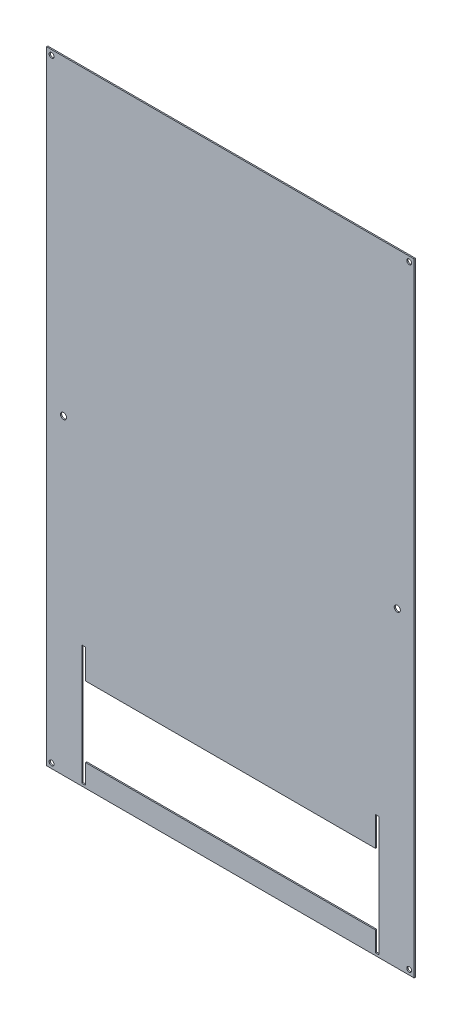
ISO-10303-21;
HEADER;
FILE_DESCRIPTION(('STEP AP214'),'2;1');
FILE_NAME('part.step','',(''),(''),'','','');
FILE_SCHEMA(('AUTOMOTIVE_DESIGN { 1 0 10303 214 1 1 1 1 }'));
ENDSEC;
DATA;
#1=APPLICATION_CONTEXT('core data for automotive mechanical design processes');
#2=APPLICATION_PROTOCOL_DEFINITION('international standard','automotive_design',2000,#1);
#3=PRODUCT_CONTEXT('',#1,'mechanical');
#4=PRODUCT('Part','Part','',(#3));
#5=PRODUCT_RELATED_PRODUCT_CATEGORY('part','',(#4));
#6=PRODUCT_DEFINITION_FORMATION('','',#4);
#7=PRODUCT_DEFINITION_CONTEXT('part definition',#1,'design');
#8=PRODUCT_DEFINITION('design','',#6,#7);
#9=PRODUCT_DEFINITION_SHAPE('','',#8);
#10=(LENGTH_UNIT() NAMED_UNIT(*) SI_UNIT(.MILLI.,.METRE.));
#11=(NAMED_UNIT(*) PLANE_ANGLE_UNIT() SI_UNIT($,.RADIAN.));
#12=(NAMED_UNIT(*) SI_UNIT($,.STERADIAN.) SOLID_ANGLE_UNIT());
#13=UNCERTAINTY_MEASURE_WITH_UNIT(LENGTH_MEASURE(1.E-05),#10,'distance_accuracy_value','');
#14=(GEOMETRIC_REPRESENTATION_CONTEXT(3) GLOBAL_UNCERTAINTY_ASSIGNED_CONTEXT((#13)) GLOBAL_UNIT_ASSIGNED_CONTEXT((#10,
#11,#12)) REPRESENTATION_CONTEXT('',''));
#15=CARTESIAN_POINT('',(0.,0.,0.));
#16=DIRECTION('',(0.,0.,1.));
#17=DIRECTION('',(1.,0.,0.));
#18=AXIS2_PLACEMENT_3D('',#15,#16,#17);
#19=CARTESIAN_POINT('',(108.847593141209,109.081292579144,1.6002));
#20=DIRECTION('',(0.,0.,-1.));
#21=DIRECTION('',(-1.,0.,0.));
#22=AXIS2_PLACEMENT_3D('',#19,#20,#21);
#23=PLANE('',#22);
#24=CARTESIAN_POINT('',(-347.198426858777,514.031343344634,1.6002));
#25=DIRECTION('',(0.,0.,1.));
#26=DIRECTION('',(1.,0.,0.));
#27=AXIS2_PLACEMENT_3D('',#24,#25,#26);
#28=CIRCLE('',#27,3.96874999998672);
#29=CARTESIAN_POINT('',(-343.22967685879,514.031343344634,1.6002));
#30=VERTEX_POINT('',#29);
#31=EDGE_CURVE('E240',#30,#30,#28,.T.);
#32=ORIENTED_EDGE('',*,*,#31,.F.);
#33=EDGE_LOOP('',(#32));
#34=FACE_BOUND('',#33,.T.);
#35=CARTESIAN_POINT('',(102.405393141209,115.522426028622,1.6002));
#36=DIRECTION('',(0.,0.,1.));
#37=DIRECTION('',(1.,0.,0.));
#38=AXIS2_PLACEMENT_3D('',#35,#36,#37);
#39=CIRCLE('',#38,3.175);
#40=CARTESIAN_POINT('',(105.580393141209,115.522426028622,1.6002));
#41=VERTEX_POINT('',#40);
#42=EDGE_CURVE('E252',#41,#41,#39,.T.);
#43=ORIENTED_EDGE('',*,*,#42,.F.);
#44=EDGE_LOOP('',(#43));
#45=FACE_BOUND('',#44,.T.);
#46=CARTESIAN_POINT('',(102.405393141209,912.540362109828,1.6002));
#47=DIRECTION('',(0.,0.,1.));
#48=DIRECTION('',(1.,0.,0.));
#49=AXIS2_PLACEMENT_3D('',#46,#47,#48);
#50=CIRCLE('',#49,3.17499999996005);
#51=CARTESIAN_POINT('',(105.580393141169,912.540362109828,1.6002));
#52=VERTEX_POINT('',#51);
#53=EDGE_CURVE('E264',#52,#52,#50,.T.);
#54=ORIENTED_EDGE('',*,*,#53,.F.);
#55=EDGE_LOOP('',(#54));
#56=FACE_BOUND('',#55,.T.);
#57=DIRECTION('',(0.,1.,0.));
#58=VECTOR('',#57,1.);
#59=CARTESIAN_POINT('',(108.847593141209,918.981394110126,1.6002));
#60=LINE('',#59,#58);
#61=CARTESIAN_POINT('',(108.847593141209,109.081292579144,1.6002));
#62=VERTEX_POINT('',#61);
#63=CARTESIAN_POINT('',(108.847593141209,918.981394110126,1.6002));
#64=VERTEX_POINT('',#63);
#65=EDGE_CURVE('E276',#62,#64,#60,.T.);
#66=ORIENTED_EDGE('',*,*,#65,.T.);
#67=DIRECTION('',(-1.,0.,0.));
#68=VECTOR('',#67,1.);
#69=CARTESIAN_POINT('',(108.847593141209,918.981394110126,1.6002));
#70=LINE('',#69,#68);
#71=CARTESIAN_POINT('',(-369.152406858763,918.981394110126,1.6002));
#72=VERTEX_POINT('',#71);
#73=EDGE_CURVE('E279',#64,#72,#70,.T.);
#74=ORIENTED_EDGE('',*,*,#73,.T.);
#75=DIRECTION('',(0.,-1.,0.));
#76=VECTOR('',#75,1.);
#77=CARTESIAN_POINT('',(-369.152406858763,918.981394110126,1.6002));
#78=LINE('',#77,#76);
#79=CARTESIAN_POINT('',(-369.152406858763,109.081292579144,1.6002));
#80=VERTEX_POINT('',#79);
#81=EDGE_CURVE('E282',#72,#80,#78,.T.);
#82=ORIENTED_EDGE('',*,*,#81,.T.);
#83=DIRECTION('',(1.,0.,0.));
#84=VECTOR('',#83,1.);
#85=CARTESIAN_POINT('',(108.847593141209,109.081292579144,1.6002));
#86=LINE('',#85,#84);
#87=EDGE_CURVE('E284',#80,#62,#86,.T.);
#88=ORIENTED_EDGE('',*,*,#87,.T.);
#89=EDGE_LOOP('',(#66,#74,#82,#88));
#90=FACE_BOUND('',#89,.T.);
#91=CARTESIAN_POINT('',(-362.710206858779,115.522426028623,1.6002));
#92=DIRECTION('',(0.,0.,1.));
#93=DIRECTION('',(1.,0.,0.));
#94=AXIS2_PLACEMENT_3D('',#91,#92,#93);
#95=CIRCLE('',#94,3.17500000002513);
#96=CARTESIAN_POINT('',(-359.535206858754,115.522426028623,1.6002));
#97=VERTEX_POINT('',#96);
#98=EDGE_CURVE('E270',#97,#97,#95,.T.);
#99=ORIENTED_EDGE('',*,*,#98,.F.);
#100=EDGE_LOOP('',(#99));
#101=FACE_BOUND('',#100,.T.);
#102=CARTESIAN_POINT('',(-362.710206858779,912.540362109827,1.6002));
#103=DIRECTION('',(0.,0.,1.));
#104=DIRECTION('',(1.,0.,0.));
#105=AXIS2_PLACEMENT_3D('',#102,#103,#104);
#106=CIRCLE('',#105,3.17500000002519);
#107=CARTESIAN_POINT('',(-359.535206858754,912.540362109827,1.6002));
#108=VERTEX_POINT('',#107);
#109=EDGE_CURVE('E258',#108,#108,#106,.T.);
#110=ORIENTED_EDGE('',*,*,#109,.F.);
#111=EDGE_LOOP('',(#110));
#112=FACE_BOUND('',#111,.T.);
#113=CARTESIAN_POINT('',(86.8936131412105,514.031343344634,1.6002));
#114=DIRECTION('',(0.,0.,1.));
#115=DIRECTION('',(1.,0.,0.));
#116=AXIS2_PLACEMENT_3D('',#113,#114,#115);
#117=CIRCLE('',#116,3.96874999998669);
#118=CARTESIAN_POINT('',(90.8623631411972,514.031343344634,1.6002));
#119=VERTEX_POINT('',#118);
#120=EDGE_CURVE('E246',#119,#119,#117,.T.);
#121=ORIENTED_EDGE('',*,*,#120,.F.);
#122=EDGE_LOOP('',(#121));
#123=FACE_BOUND('',#122,.T.);
#124=DIRECTION('',(1.,0.,0.));
#125=VECTOR('',#124,1.);
#126=CARTESIAN_POINT('',(58.3488931412082,112.358892329855,1.6002));
#127=LINE('',#126,#125);
#128=CARTESIAN_POINT('',(58.3488931412082,112.358892329855,1.6002));
#129=VERTEX_POINT('',#128);
#130=CARTESIAN_POINT('',(63.1113931412082,112.358892329856,1.6002));
#131=VERTEX_POINT('',#130);
#132=EDGE_CURVE('E146',#129,#131,#127,.T.);
#133=ORIENTED_EDGE('',*,*,#132,.F.);
#134=DIRECTION('',(1.18370548896306E-12,-1.,0.));
#135=VECTOR('',#134,1.);
#136=CARTESIAN_POINT('',(58.3488931411778,138.081394028329,1.6002));
#137=LINE('',#136,#135);
#138=CARTESIAN_POINT('',(58.3488931411778,138.081394028329,1.6002));
#139=VERTEX_POINT('',#138);
#140=EDGE_CURVE('E187',#139,#129,#137,.T.);
#141=ORIENTED_EDGE('',*,*,#140,.F.);
#142=DIRECTION('',(1.,0.,0.));
#143=VECTOR('',#142,1.);
#144=CARTESIAN_POINT('',(-318.667460794084,138.081394028324,1.6002));
#145=LINE('',#144,#143);
#146=CARTESIAN_POINT('',(-318.667460794084,138.081394028324,1.6002));
#147=VERTEX_POINT('',#146);
#148=EDGE_CURVE('E185',#147,#139,#145,.T.);
#149=ORIENTED_EDGE('',*,*,#148,.F.);
#150=DIRECTION('',(-1.1826264502311E-12,1.,0.));
#151=VECTOR('',#150,1.);
#152=CARTESIAN_POINT('',(-318.667460794053,112.358892329851,1.6002));
#153=LINE('',#152,#151);
#154=CARTESIAN_POINT('',(-318.667460794053,112.358892329851,1.6002));
#155=VERTEX_POINT('',#154);
#156=EDGE_CURVE('E183',#155,#147,#153,.T.);
#157=ORIENTED_EDGE('',*,*,#156,.F.);
#158=DIRECTION('',(1.,0.,0.));
#159=VECTOR('',#158,1.);
#160=CARTESIAN_POINT('',(-323.429960794053,112.358892329851,1.6002));
#161=LINE('',#160,#159);
#162=CARTESIAN_POINT('',(-323.429960794053,112.358892329851,1.6002));
#163=VERTEX_POINT('',#162);
#164=EDGE_CURVE('E181',#163,#155,#161,.T.);
#165=ORIENTED_EDGE('',*,*,#164,.F.);
#166=DIRECTION('',(0.,-1.,0.));
#167=VECTOR('',#166,1.);
#168=CARTESIAN_POINT('',(-323.429960794077,229.898149854757,1.6002));
#169=LINE('',#168,#167);
#170=CARTESIAN_POINT('',(-323.42996079408,268.081394028324,1.6002));
#171=VERTEX_POINT('',#170);
#172=EDGE_CURVE('E179',#171,#163,#169,.T.);
#173=ORIENTED_EDGE('',*,*,#172,.F.);
#174=DIRECTION('',(-1.,0.,0.));
#175=VECTOR('',#174,1.);
#176=CARTESIAN_POINT('',(-323.42996079408,268.081394028324,1.6002));
#177=LINE('',#176,#175);
#178=CARTESIAN_POINT('',(-318.66746079408,268.081394028324,1.6002));
#179=VERTEX_POINT('',#178);
#180=EDGE_CURVE('E177',#179,#171,#177,.T.);
#181=ORIENTED_EDGE('',*,*,#180,.F.);
#182=DIRECTION('',(0.,1.,0.));
#183=VECTOR('',#182,1.);
#184=CARTESIAN_POINT('',(-318.667460794077,229.898149854757,1.6002));
#185=LINE('',#184,#183);
#186=CARTESIAN_POINT('',(-318.667460794077,229.898149854757,1.6002));
#187=VERTEX_POINT('',#186);
#188=EDGE_CURVE('E175',#187,#179,#185,.T.);
#189=ORIENTED_EDGE('',*,*,#188,.F.);
#190=DIRECTION('',(-1.,0.,0.));
#191=VECTOR('',#190,1.);
#192=CARTESIAN_POINT('',(-318.667460794077,229.898149854757,1.6002));
#193=LINE('',#192,#191);
#194=CARTESIAN_POINT('',(58.3488931411847,229.898149854762,1.6002));
#195=VERTEX_POINT('',#194);
#196=EDGE_CURVE('E173',#195,#187,#193,.T.);
#197=ORIENTED_EDGE('',*,*,#196,.F.);
#198=DIRECTION('',(0.,-1.,0.));
#199=VECTOR('',#198,1.);
#200=CARTESIAN_POINT('',(58.3488931411847,229.898149854762,1.6002));
#201=LINE('',#200,#199);
#202=CARTESIAN_POINT('',(58.3488931411816,268.081394028329,1.6002));
#203=VERTEX_POINT('',#202);
#204=EDGE_CURVE('E169',#203,#195,#201,.T.);
#205=ORIENTED_EDGE('',*,*,#204,.F.);
#206=DIRECTION('',(-1.,0.,0.));
#207=VECTOR('',#206,1.);
#208=CARTESIAN_POINT('',(58.3488931411816,268.081394028329,1.6002));
#209=LINE('',#208,#207);
#210=CARTESIAN_POINT('',(63.1113931411816,268.081394028329,1.6002));
#211=VERTEX_POINT('',#210);
#212=EDGE_CURVE('E167',#211,#203,#209,.T.);
#213=ORIENTED_EDGE('',*,*,#212,.F.);
#214=DIRECTION('',(-2.00363745745721E-13,1.,0.));
#215=VECTOR('',#214,1.);
#216=CARTESIAN_POINT('',(63.1113931412082,112.358892329856,1.6002));
#217=LINE('',#216,#215);
#218=EDGE_CURVE('E154',#131,#211,#217,.T.);
#219=ORIENTED_EDGE('',*,*,#218,.F.);
#220=EDGE_LOOP('',(#133,#141,#149,#157,#165,#173,#181,#189,#197,#205,#213,#219));
#221=FACE_BOUND('',#220,.T.);
#222=ADVANCED_FACE('F33',(#34,#45,#56,#90,#101,#112,#123,#221),#23,.F.);
#223=CARTESIAN_POINT('',(108.847593141209,109.081292579144,0.));
#224=DIRECTION('',(0.,0.,-1.));
#225=DIRECTION('',(-1.,0.,0.));
#226=AXIS2_PLACEMENT_3D('',#223,#224,#225);
#227=PLANE('',#226);
#228=CARTESIAN_POINT('',(-347.198426858777,514.031343344634,0.));
#229=DIRECTION('',(0.,0.,1.));
#230=DIRECTION('',(1.,0.,0.));
#231=AXIS2_PLACEMENT_3D('',#228,#229,#230);
#232=CIRCLE('',#231,3.96874999998672);
#233=CARTESIAN_POINT('',(-343.22967685879,514.031343344634,0.));
#234=VERTEX_POINT('',#233);
#235=EDGE_CURVE('E162',#234,#234,#232,.T.);
#236=ORIENTED_EDGE('',*,*,#235,.T.);
#237=EDGE_LOOP('',(#236));
#238=FACE_BOUND('',#237,.T.);
#239=CARTESIAN_POINT('',(102.405393141209,115.522426028622,0.));
#240=DIRECTION('',(0.,0.,1.));
#241=DIRECTION('',(1.,0.,0.));
#242=AXIS2_PLACEMENT_3D('',#239,#240,#241);
#243=CIRCLE('',#242,3.175);
#244=CARTESIAN_POINT('',(105.580393141209,115.522426028622,0.));
#245=VERTEX_POINT('',#244);
#246=EDGE_CURVE('E249',#245,#245,#243,.T.);
#247=ORIENTED_EDGE('',*,*,#246,.T.);
#248=EDGE_LOOP('',(#247));
#249=FACE_BOUND('',#248,.T.);
#250=CARTESIAN_POINT('',(102.405393141209,912.540362109828,0.));
#251=DIRECTION('',(0.,0.,1.));
#252=DIRECTION('',(1.,0.,0.));
#253=AXIS2_PLACEMENT_3D('',#250,#251,#252);
#254=CIRCLE('',#253,3.17499999996005);
#255=CARTESIAN_POINT('',(105.580393141169,912.540362109828,0.));
#256=VERTEX_POINT('',#255);
#257=EDGE_CURVE('E261',#256,#256,#254,.T.);
#258=ORIENTED_EDGE('',*,*,#257,.T.);
#259=EDGE_LOOP('',(#258));
#260=FACE_BOUND('',#259,.T.);
#261=DIRECTION('',(0.,1.,0.));
#262=VECTOR('',#261,1.);
#263=CARTESIAN_POINT('',(108.847593141209,918.981394110126,0.));
#264=LINE('',#263,#262);
#265=CARTESIAN_POINT('',(108.847593141209,109.081292579144,0.));
#266=VERTEX_POINT('',#265);
#267=CARTESIAN_POINT('',(108.847593141209,918.981394110126,0.));
#268=VERTEX_POINT('',#267);
#269=EDGE_CURVE('E273',#266,#268,#264,.T.);
#270=ORIENTED_EDGE('',*,*,#269,.F.);
#271=DIRECTION('',(1.,0.,0.));
#272=VECTOR('',#271,1.);
#273=CARTESIAN_POINT('',(108.847593141209,109.081292579144,0.));
#274=LINE('',#273,#272);
#275=CARTESIAN_POINT('',(-369.152406858763,109.081292579144,0.));
#276=VERTEX_POINT('',#275);
#277=EDGE_CURVE('E280',#276,#266,#274,.T.);
#278=ORIENTED_EDGE('',*,*,#277,.F.);
#279=DIRECTION('',(0.,-1.,0.));
#280=VECTOR('',#279,1.);
#281=CARTESIAN_POINT('',(-369.152406858763,918.981394110126,0.));
#282=LINE('',#281,#280);
#283=CARTESIAN_POINT('',(-369.152406858763,918.981394110126,0.));
#284=VERTEX_POINT('',#283);
#285=EDGE_CURVE('E291',#284,#276,#282,.T.);
#286=ORIENTED_EDGE('',*,*,#285,.F.);
#287=DIRECTION('',(-1.,0.,0.));
#288=VECTOR('',#287,1.);
#289=CARTESIAN_POINT('',(108.847593141209,918.981394110126,0.));
#290=LINE('',#289,#288);
#291=EDGE_CURVE('E289',#268,#284,#290,.T.);
#292=ORIENTED_EDGE('',*,*,#291,.F.);
#293=EDGE_LOOP('',(#270,#278,#286,#292));
#294=FACE_BOUND('',#293,.T.);
#295=CARTESIAN_POINT('',(-362.710206858779,115.522426028623,0.));
#296=DIRECTION('',(0.,0.,1.));
#297=DIRECTION('',(1.,0.,0.));
#298=AXIS2_PLACEMENT_3D('',#295,#296,#297);
#299=CIRCLE('',#298,3.17500000002513);
#300=CARTESIAN_POINT('',(-359.535206858754,115.522426028623,0.));
#301=VERTEX_POINT('',#300);
#302=EDGE_CURVE('E267',#301,#301,#299,.T.);
#303=ORIENTED_EDGE('',*,*,#302,.T.);
#304=EDGE_LOOP('',(#303));
#305=FACE_BOUND('',#304,.T.);
#306=CARTESIAN_POINT('',(-362.710206858779,912.540362109827,0.));
#307=DIRECTION('',(0.,0.,1.));
#308=DIRECTION('',(1.,0.,0.));
#309=AXIS2_PLACEMENT_3D('',#306,#307,#308);
#310=CIRCLE('',#309,3.17500000002519);
#311=CARTESIAN_POINT('',(-359.535206858754,912.540362109827,0.));
#312=VERTEX_POINT('',#311);
#313=EDGE_CURVE('E255',#312,#312,#310,.T.);
#314=ORIENTED_EDGE('',*,*,#313,.T.);
#315=EDGE_LOOP('',(#314));
#316=FACE_BOUND('',#315,.T.);
#317=CARTESIAN_POINT('',(86.8936131412105,514.031343344634,0.));
#318=DIRECTION('',(0.,0.,1.));
#319=DIRECTION('',(1.,0.,0.));
#320=AXIS2_PLACEMENT_3D('',#317,#318,#319);
#321=CIRCLE('',#320,3.96874999998669);
#322=CARTESIAN_POINT('',(90.8623631411972,514.031343344634,0.));
#323=VERTEX_POINT('',#322);
#324=EDGE_CURVE('E243',#323,#323,#321,.T.);
#325=ORIENTED_EDGE('',*,*,#324,.T.);
#326=EDGE_LOOP('',(#325));
#327=FACE_BOUND('',#326,.T.);
#328=DIRECTION('',(1.18370548896306E-12,-1.,0.));
#329=VECTOR('',#328,1.);
#330=CARTESIAN_POINT('',(58.3488931411778,138.081394028329,0.));
#331=LINE('',#330,#329);
#332=CARTESIAN_POINT('',(58.3488931411778,138.081394028329,0.));
#333=VERTEX_POINT('',#332);
#334=CARTESIAN_POINT('',(58.3488931412082,112.358892329855,0.));
#335=VERTEX_POINT('',#334);
#336=EDGE_CURVE('E155',#333,#335,#331,.T.);
#337=ORIENTED_EDGE('',*,*,#336,.T.);
#338=DIRECTION('',(1.,0.,0.));
#339=VECTOR('',#338,1.);
#340=CARTESIAN_POINT('',(58.3488931412082,112.358892329855,0.));
#341=LINE('',#340,#339);
#342=CARTESIAN_POINT('',(63.1113931412082,112.358892329856,0.));
#343=VERTEX_POINT('',#342);
#344=EDGE_CURVE('E56',#335,#343,#341,.T.);
#345=ORIENTED_EDGE('',*,*,#344,.T.);
#346=DIRECTION('',(0.,1.,0.));
#347=VECTOR('',#346,1.);
#348=CARTESIAN_POINT('',(63.1113931411847,229.898149854762,0.));
#349=LINE('',#348,#347);
#350=CARTESIAN_POINT('',(63.1113931411816,268.081394028329,0.));
#351=VERTEX_POINT('',#350);
#352=EDGE_CURVE('E161',#343,#351,#349,.T.);
#353=ORIENTED_EDGE('',*,*,#352,.T.);
#354=DIRECTION('',(-1.,0.,0.));
#355=VECTOR('',#354,1.);
#356=CARTESIAN_POINT('',(58.3488931411816,268.081394028329,0.));
#357=LINE('',#356,#355);
#358=CARTESIAN_POINT('',(58.3488931411816,268.081394028329,0.));
#359=VERTEX_POINT('',#358);
#360=EDGE_CURVE('E191',#351,#359,#357,.T.);
#361=ORIENTED_EDGE('',*,*,#360,.T.);
#362=DIRECTION('',(0.,-1.,0.));
#363=VECTOR('',#362,1.);
#364=CARTESIAN_POINT('',(58.3488931411847,229.898149854762,0.));
#365=LINE('',#364,#363);
#366=CARTESIAN_POINT('',(58.3488931411847,229.898149854762,0.));
#367=VERTEX_POINT('',#366);
#368=EDGE_CURVE('E194',#359,#367,#365,.T.);
#369=ORIENTED_EDGE('',*,*,#368,.T.);
#370=DIRECTION('',(-1.,0.,0.));
#371=VECTOR('',#370,1.);
#372=CARTESIAN_POINT('',(-318.667460794077,229.898149854757,0.));
#373=LINE('',#372,#371);
#374=CARTESIAN_POINT('',(-318.667460794077,229.898149854757,0.));
#375=VERTEX_POINT('',#374);
#376=EDGE_CURVE('E197',#367,#375,#373,.T.);
#377=ORIENTED_EDGE('',*,*,#376,.T.);
#378=DIRECTION('',(0.,1.,0.));
#379=VECTOR('',#378,1.);
#380=CARTESIAN_POINT('',(-318.667460794077,229.898149854757,0.));
#381=LINE('',#380,#379);
#382=CARTESIAN_POINT('',(-318.66746079408,268.081394028324,0.));
#383=VERTEX_POINT('',#382);
#384=EDGE_CURVE('E200',#375,#383,#381,.T.);
#385=ORIENTED_EDGE('',*,*,#384,.T.);
#386=DIRECTION('',(-1.,0.,0.));
#387=VECTOR('',#386,1.);
#388=CARTESIAN_POINT('',(-323.42996079408,268.081394028324,0.));
#389=LINE('',#388,#387);
#390=CARTESIAN_POINT('',(-323.42996079408,268.081394028324,0.));
#391=VERTEX_POINT('',#390);
#392=EDGE_CURVE('E203',#383,#391,#389,.T.);
#393=ORIENTED_EDGE('',*,*,#392,.T.);
#394=DIRECTION('',(1.99773398822486E-13,-1.,0.));
#395=VECTOR('',#394,1.);
#396=CARTESIAN_POINT('',(-323.429960794077,229.898149854757,0.));
#397=LINE('',#396,#395);
#398=CARTESIAN_POINT('',(-323.429960794053,112.358892329851,0.));
#399=VERTEX_POINT('',#398);
#400=EDGE_CURVE('E206',#391,#399,#397,.T.);
#401=ORIENTED_EDGE('',*,*,#400,.T.);
#402=DIRECTION('',(1.,0.,0.));
#403=VECTOR('',#402,1.);
#404=CARTESIAN_POINT('',(-323.429960794053,112.358892329851,0.));
#405=LINE('',#404,#403);
#406=CARTESIAN_POINT('',(-318.667460794053,112.358892329851,0.));
#407=VERTEX_POINT('',#406);
#408=EDGE_CURVE('E209',#399,#407,#405,.T.);
#409=ORIENTED_EDGE('',*,*,#408,.T.);
#410=DIRECTION('',(-1.1826264502311E-12,1.,0.));
#411=VECTOR('',#410,1.);
#412=CARTESIAN_POINT('',(-318.667460794053,112.358892329851,0.));
#413=LINE('',#412,#411);
#414=CARTESIAN_POINT('',(-318.667460794084,138.081394028324,0.));
#415=VERTEX_POINT('',#414);
#416=EDGE_CURVE('E212',#407,#415,#413,.T.);
#417=ORIENTED_EDGE('',*,*,#416,.T.);
#418=DIRECTION('',(1.,0.,0.));
#419=VECTOR('',#418,1.);
#420=CARTESIAN_POINT('',(-318.667460794084,138.081394028324,0.));
#421=LINE('',#420,#419);
#422=EDGE_CURVE('E215',#415,#333,#421,.T.);
#423=ORIENTED_EDGE('',*,*,#422,.T.);
#424=EDGE_LOOP('',(#337,#345,#353,#361,#369,#377,#385,#393,#401,#409,#417,#423));
#425=FACE_BOUND('',#424,.T.);
#426=ADVANCED_FACE('F309',(#238,#249,#260,#294,#305,#316,#327,#425),#227,.T.);
#427=CARTESIAN_POINT('',(108.847593141209,918.981394110126,1.6002));
#428=DIRECTION('',(-1.,0.,0.));
#429=DIRECTION('',(0.,-1.,0.));
#430=AXIS2_PLACEMENT_3D('',#427,#428,#429);
#431=PLANE('',#430);
#432=ORIENTED_EDGE('',*,*,#269,.T.);
#433=DIRECTION('',(0.,0.,-1.));
#434=VECTOR('',#433,1.);
#435=CARTESIAN_POINT('',(108.847593141209,918.981394110126,1.6002));
#436=LINE('',#435,#434);
#437=EDGE_CURVE('E11',#64,#268,#436,.T.);
#438=ORIENTED_EDGE('',*,*,#437,.F.);
#439=ORIENTED_EDGE('',*,*,#65,.F.);
#440=DIRECTION('',(0.,0.,-1.));
#441=VECTOR('',#440,1.);
#442=CARTESIAN_POINT('',(108.847593141209,109.081292579144,1.6002));
#443=LINE('',#442,#441);
#444=EDGE_CURVE('E286',#62,#266,#443,.T.);
#445=ORIENTED_EDGE('',*,*,#444,.T.);
#446=EDGE_LOOP('',(#432,#438,#439,#445));
#447=FACE_BOUND('',#446,.T.);
#448=ADVANCED_FACE('F35',(#447),#431,.F.);
#449=CARTESIAN_POINT('',(108.847593141209,918.981394110126,1.6002));
#450=DIRECTION('',(0.,-1.,0.));
#451=DIRECTION('',(1.,0.,0.));
#452=AXIS2_PLACEMENT_3D('',#449,#450,#451);
#453=PLANE('',#452);
#454=ORIENTED_EDGE('',*,*,#291,.T.);
#455=DIRECTION('',(0.,0.,-1.));
#456=VECTOR('',#455,1.);
#457=CARTESIAN_POINT('',(-369.152406858763,918.981394110126,1.6002));
#458=LINE('',#457,#456);
#459=EDGE_CURVE('E41',#72,#284,#458,.T.);
#460=ORIENTED_EDGE('',*,*,#459,.F.);
#461=ORIENTED_EDGE('',*,*,#73,.F.);
#462=ORIENTED_EDGE('',*,*,#437,.T.);
#463=EDGE_LOOP('',(#454,#460,#461,#462));
#464=FACE_BOUND('',#463,.T.);
#465=ADVANCED_FACE('F320',(#464),#453,.F.);
#466=CARTESIAN_POINT('',(-369.152406858763,918.981394110126,1.6002));
#467=DIRECTION('',(1.,0.,0.));
#468=DIRECTION('',(0.,1.,0.));
#469=AXIS2_PLACEMENT_3D('',#466,#467,#468);
#470=PLANE('',#469);
#471=ORIENTED_EDGE('',*,*,#285,.T.);
#472=DIRECTION('',(0.,0.,-1.));
#473=VECTOR('',#472,1.);
#474=CARTESIAN_POINT('',(-369.152406858763,109.081292579144,1.6002));
#475=LINE('',#474,#473);
#476=EDGE_CURVE('E296',#80,#276,#475,.T.);
#477=ORIENTED_EDGE('',*,*,#476,.F.);
#478=ORIENTED_EDGE('',*,*,#81,.F.);
#479=ORIENTED_EDGE('',*,*,#459,.T.);
#480=EDGE_LOOP('',(#471,#477,#478,#479));
#481=FACE_BOUND('',#480,.T.);
#482=ADVANCED_FACE('F303',(#481),#470,.F.);
#483=CARTESIAN_POINT('',(108.847593141209,109.081292579144,1.6002));
#484=DIRECTION('',(0.,1.,0.));
#485=DIRECTION('',(0.,0.,1.));
#486=AXIS2_PLACEMENT_3D('',#483,#484,#485);
#487=PLANE('',#486);
#488=ORIENTED_EDGE('',*,*,#277,.T.);
#489=ORIENTED_EDGE('',*,*,#444,.F.);
#490=ORIENTED_EDGE('',*,*,#87,.F.);
#491=ORIENTED_EDGE('',*,*,#476,.T.);
#492=EDGE_LOOP('',(#488,#489,#490,#491));
#493=FACE_BOUND('',#492,.T.);
#494=ADVANCED_FACE('F313',(#493),#487,.F.);
#495=CARTESIAN_POINT('',(-362.710206858779,115.522426028623,1.6002));
#496=DIRECTION('',(0.,0.,-1.));
#497=DIRECTION('',(-1.,0.,0.));
#498=AXIS2_PLACEMENT_3D('',#495,#496,#497);
#499=CYLINDRICAL_SURFACE('',#498,3.17500000002513);
#500=ORIENTED_EDGE('',*,*,#98,.T.);
#501=EDGE_LOOP('',(#500));
#502=FACE_BOUND('',#501,.T.);
#503=ORIENTED_EDGE('',*,*,#302,.F.);
#504=EDGE_LOOP('',(#503));
#505=FACE_BOUND('',#504,.T.);
#506=ADVANCED_FACE('F338',(#502,#505),#499,.F.);
#507=CARTESIAN_POINT('',(102.405393141209,912.540362109828,1.6002));
#508=DIRECTION('',(0.,0.,-1.));
#509=DIRECTION('',(-1.,0.,0.));
#510=AXIS2_PLACEMENT_3D('',#507,#508,#509);
#511=CYLINDRICAL_SURFACE('',#510,3.17499999996005);
#512=ORIENTED_EDGE('',*,*,#53,.T.);
#513=EDGE_LOOP('',(#512));
#514=FACE_BOUND('',#513,.T.);
#515=ORIENTED_EDGE('',*,*,#257,.F.);
#516=EDGE_LOOP('',(#515));
#517=FACE_BOUND('',#516,.T.);
#518=ADVANCED_FACE('F345',(#514,#517),#511,.F.);
#519=CARTESIAN_POINT('',(-362.710206858779,912.540362109827,1.6002));
#520=DIRECTION('',(0.,0.,-1.));
#521=DIRECTION('',(-1.,0.,0.));
#522=AXIS2_PLACEMENT_3D('',#519,#520,#521);
#523=CYLINDRICAL_SURFACE('',#522,3.17500000002519);
#524=ORIENTED_EDGE('',*,*,#109,.T.);
#525=EDGE_LOOP('',(#524));
#526=FACE_BOUND('',#525,.T.);
#527=ORIENTED_EDGE('',*,*,#313,.F.);
#528=EDGE_LOOP('',(#527));
#529=FACE_BOUND('',#528,.T.);
#530=ADVANCED_FACE('F350',(#526,#529),#523,.F.);
#531=CARTESIAN_POINT('',(102.405393141209,115.522426028622,1.6002));
#532=DIRECTION('',(0.,0.,-1.));
#533=DIRECTION('',(-1.,0.,0.));
#534=AXIS2_PLACEMENT_3D('',#531,#532,#533);
#535=CYLINDRICAL_SURFACE('',#534,3.175);
#536=ORIENTED_EDGE('',*,*,#42,.T.);
#537=EDGE_LOOP('',(#536));
#538=FACE_BOUND('',#537,.T.);
#539=ORIENTED_EDGE('',*,*,#246,.F.);
#540=EDGE_LOOP('',(#539));
#541=FACE_BOUND('',#540,.T.);
#542=ADVANCED_FACE('F421',(#538,#541),#535,.F.);
#543=CARTESIAN_POINT('',(86.8936131412105,514.031343344634,1.6002));
#544=DIRECTION('',(0.,0.,-1.));
#545=DIRECTION('',(-1.,0.,0.));
#546=AXIS2_PLACEMENT_3D('',#543,#544,#545);
#547=CYLINDRICAL_SURFACE('',#546,3.96874999998669);
#548=ORIENTED_EDGE('',*,*,#120,.T.);
#549=EDGE_LOOP('',(#548));
#550=FACE_BOUND('',#549,.T.);
#551=ORIENTED_EDGE('',*,*,#324,.F.);
#552=EDGE_LOOP('',(#551));
#553=FACE_BOUND('',#552,.T.);
#554=ADVANCED_FACE('F417',(#550,#553),#547,.F.);
#555=CARTESIAN_POINT('',(-347.198426858777,514.031343344634,1.6002));
#556=DIRECTION('',(0.,0.,-1.));
#557=DIRECTION('',(-1.,0.,0.));
#558=AXIS2_PLACEMENT_3D('',#555,#556,#557);
#559=CYLINDRICAL_SURFACE('',#558,3.96874999998672);
#560=ORIENTED_EDGE('',*,*,#31,.T.);
#561=EDGE_LOOP('',(#560));
#562=FACE_BOUND('',#561,.T.);
#563=ORIENTED_EDGE('',*,*,#235,.F.);
#564=EDGE_LOOP('',(#563));
#565=FACE_BOUND('',#564,.T.);
#566=ADVANCED_FACE('F414',(#562,#565),#559,.F.);
#567=CARTESIAN_POINT('',(58.3488931412082,112.358892329855,1.6002));
#568=DIRECTION('',(0.,1.,0.));
#569=DIRECTION('',(-1.,0.,0.));
#570=AXIS2_PLACEMENT_3D('',#567,#568,#569);
#571=PLANE('',#570);
#572=ORIENTED_EDGE('',*,*,#344,.F.);
#573=DIRECTION('',(0.,0.,-1.));
#574=VECTOR('',#573,1.);
#575=CARTESIAN_POINT('',(58.3488931412082,112.358892329855,1.6002));
#576=LINE('',#575,#574);
#577=EDGE_CURVE('E150',#129,#335,#576,.T.);
#578=ORIENTED_EDGE('',*,*,#577,.F.);
#579=ORIENTED_EDGE('',*,*,#132,.T.);
#580=DIRECTION('',(0.,0.,-1.));
#581=VECTOR('',#580,1.);
#582=CARTESIAN_POINT('',(63.1113931412082,112.358892329856,1.6002));
#583=LINE('',#582,#581);
#584=EDGE_CURVE('E149',#131,#343,#583,.T.);
#585=ORIENTED_EDGE('',*,*,#584,.T.);
#586=EDGE_LOOP('',(#572,#578,#579,#585));
#587=FACE_BOUND('',#586,.T.);
#588=ADVANCED_FACE('F148',(#587),#571,.T.);
#589=CARTESIAN_POINT('',(63.1113931411847,229.898149854762,1.6002));
#590=DIRECTION('',(-1.,0.,0.));
#591=DIRECTION('',(0.,-1.,0.));
#592=AXIS2_PLACEMENT_3D('',#589,#590,#591);
#593=PLANE('',#592);
#594=ORIENTED_EDGE('',*,*,#352,.F.);
#595=ORIENTED_EDGE('',*,*,#584,.F.);
#596=ORIENTED_EDGE('',*,*,#218,.T.);
#597=DIRECTION('',(0.,0.,-1.));
#598=VECTOR('',#597,1.);
#599=CARTESIAN_POINT('',(63.1113931411816,268.081394028329,1.6002));
#600=LINE('',#599,#598);
#601=EDGE_CURVE('E163',#211,#351,#600,.T.);
#602=ORIENTED_EDGE('',*,*,#601,.T.);
#603=EDGE_LOOP('',(#594,#595,#596,#602));
#604=FACE_BOUND('',#603,.T.);
#605=ADVANCED_FACE('F158',(#604),#593,.T.);
#606=CARTESIAN_POINT('',(58.3488931411816,268.081394028329,1.6002));
#607=DIRECTION('',(0.,-1.,0.));
#608=DIRECTION('',(1.,0.,0.));
#609=AXIS2_PLACEMENT_3D('',#606,#607,#608);
#610=PLANE('',#609);
#611=ORIENTED_EDGE('',*,*,#360,.F.);
#612=ORIENTED_EDGE('',*,*,#601,.F.);
#613=ORIENTED_EDGE('',*,*,#212,.T.);
#614=DIRECTION('',(0.,0.,-1.));
#615=VECTOR('',#614,1.);
#616=CARTESIAN_POINT('',(58.3488931411816,268.081394028329,1.6002));
#617=LINE('',#616,#615);
#618=EDGE_CURVE('E237',#203,#359,#617,.T.);
#619=ORIENTED_EDGE('',*,*,#618,.T.);
#620=EDGE_LOOP('',(#611,#612,#613,#619));
#621=FACE_BOUND('',#620,.T.);
#622=ADVANCED_FACE('F401',(#621),#610,.T.);
#623=CARTESIAN_POINT('',(58.3488931411847,229.898149854762,1.6002));
#624=DIRECTION('',(1.,0.,0.));
#625=DIRECTION('',(0.,1.,0.));
#626=AXIS2_PLACEMENT_3D('',#623,#624,#625);
#627=PLANE('',#626);
#628=ORIENTED_EDGE('',*,*,#368,.F.);
#629=ORIENTED_EDGE('',*,*,#618,.F.);
#630=ORIENTED_EDGE('',*,*,#204,.T.);
#631=DIRECTION('',(0.,0.,-1.));
#632=VECTOR('',#631,1.);
#633=CARTESIAN_POINT('',(58.3488931411847,229.898149854762,1.6002));
#634=LINE('',#633,#632);
#635=EDGE_CURVE('E235',#195,#367,#634,.T.);
#636=ORIENTED_EDGE('',*,*,#635,.T.);
#637=EDGE_LOOP('',(#628,#629,#630,#636));
#638=FACE_BOUND('',#637,.T.);
#639=ADVANCED_FACE('F397',(#638),#627,.T.);
#640=CARTESIAN_POINT('',(-318.667460794077,229.898149854757,1.6002));
#641=DIRECTION('',(0.,-1.,0.));
#642=DIRECTION('',(1.,0.,0.));
#643=AXIS2_PLACEMENT_3D('',#640,#641,#642);
#644=PLANE('',#643);
#645=ORIENTED_EDGE('',*,*,#376,.F.);
#646=ORIENTED_EDGE('',*,*,#635,.F.);
#647=ORIENTED_EDGE('',*,*,#196,.T.);
#648=DIRECTION('',(0.,0.,-1.));
#649=VECTOR('',#648,1.);
#650=CARTESIAN_POINT('',(-318.667460794077,229.898149854757,1.6002));
#651=LINE('',#650,#649);
#652=EDGE_CURVE('E233',#187,#375,#651,.T.);
#653=ORIENTED_EDGE('',*,*,#652,.T.);
#654=EDGE_LOOP('',(#645,#646,#647,#653));
#655=FACE_BOUND('',#654,.T.);
#656=ADVANCED_FACE('F394',(#655),#644,.T.);
#657=CARTESIAN_POINT('',(-318.667460794077,229.898149854757,1.6002));
#658=DIRECTION('',(-1.,0.,0.));
#659=DIRECTION('',(0.,-1.,0.));
#660=AXIS2_PLACEMENT_3D('',#657,#658,#659);
#661=PLANE('',#660);
#662=ORIENTED_EDGE('',*,*,#384,.F.);
#663=ORIENTED_EDGE('',*,*,#652,.F.);
#664=ORIENTED_EDGE('',*,*,#188,.T.);
#665=DIRECTION('',(0.,0.,-1.));
#666=VECTOR('',#665,1.);
#667=CARTESIAN_POINT('',(-318.66746079408,268.081394028324,1.6002));
#668=LINE('',#667,#666);
#669=EDGE_CURVE('E231',#179,#383,#668,.T.);
#670=ORIENTED_EDGE('',*,*,#669,.T.);
#671=EDGE_LOOP('',(#662,#663,#664,#670));
#672=FACE_BOUND('',#671,.T.);
#673=ADVANCED_FACE('F390',(#672),#661,.T.);
#674=CARTESIAN_POINT('',(-323.42996079408,268.081394028324,1.6002));
#675=DIRECTION('',(0.,-1.,0.));
#676=DIRECTION('',(1.,0.,0.));
#677=AXIS2_PLACEMENT_3D('',#674,#675,#676);
#678=PLANE('',#677);
#679=ORIENTED_EDGE('',*,*,#392,.F.);
#680=ORIENTED_EDGE('',*,*,#669,.F.);
#681=ORIENTED_EDGE('',*,*,#180,.T.);
#682=DIRECTION('',(0.,0.,-1.));
#683=VECTOR('',#682,1.);
#684=CARTESIAN_POINT('',(-323.42996079408,268.081394028324,1.6002));
#685=LINE('',#684,#683);
#686=EDGE_CURVE('E228',#171,#391,#685,.T.);
#687=ORIENTED_EDGE('',*,*,#686,.T.);
#688=EDGE_LOOP('',(#679,#680,#681,#687));
#689=FACE_BOUND('',#688,.T.);
#690=ADVANCED_FACE('F384',(#689),#678,.T.);
#691=CARTESIAN_POINT('',(-323.429960794077,229.898149854757,1.6002));
#692=DIRECTION('',(1.,1.99773398822486E-13,0.));
#693=DIRECTION('',(-1.99773398822486E-13,1.,0.));
#694=AXIS2_PLACEMENT_3D('',#691,#692,#693);
#695=PLANE('',#694);
#696=ORIENTED_EDGE('',*,*,#400,.F.);
#697=ORIENTED_EDGE('',*,*,#686,.F.);
#698=ORIENTED_EDGE('',*,*,#172,.T.);
#699=DIRECTION('',(0.,0.,-1.));
#700=VECTOR('',#699,1.);
#701=CARTESIAN_POINT('',(-323.429960794053,112.358892329851,1.6002));
#702=LINE('',#701,#700);
#703=EDGE_CURVE('E226',#163,#399,#702,.T.);
#704=ORIENTED_EDGE('',*,*,#703,.T.);
#705=EDGE_LOOP('',(#696,#697,#698,#704));
#706=FACE_BOUND('',#705,.T.);
#707=ADVANCED_FACE('F381',(#706),#695,.T.);
#708=CARTESIAN_POINT('',(-323.429960794053,112.358892329851,1.6002));
#709=DIRECTION('',(0.,1.,0.));
#710=DIRECTION('',(0.,0.,1.));
#711=AXIS2_PLACEMENT_3D('',#708,#709,#710);
#712=PLANE('',#711);
#713=ORIENTED_EDGE('',*,*,#408,.F.);
#714=ORIENTED_EDGE('',*,*,#703,.F.);
#715=ORIENTED_EDGE('',*,*,#164,.T.);
#716=DIRECTION('',(0.,0.,-1.));
#717=VECTOR('',#716,1.);
#718=CARTESIAN_POINT('',(-318.667460794053,112.358892329851,1.6002));
#719=LINE('',#718,#717);
#720=EDGE_CURVE('E224',#155,#407,#719,.T.);
#721=ORIENTED_EDGE('',*,*,#720,.T.);
#722=EDGE_LOOP('',(#713,#714,#715,#721));
#723=FACE_BOUND('',#722,.T.);
#724=ADVANCED_FACE('F374',(#723),#712,.T.);
#725=CARTESIAN_POINT('',(-318.667460794053,112.358892329851,1.6002));
#726=DIRECTION('',(-1.,-1.1826264502311E-12,0.));
#727=DIRECTION('',(1.1826264502311E-12,-1.,0.));
#728=AXIS2_PLACEMENT_3D('',#725,#726,#727);
#729=PLANE('',#728);
#730=ORIENTED_EDGE('',*,*,#416,.F.);
#731=ORIENTED_EDGE('',*,*,#720,.F.);
#732=ORIENTED_EDGE('',*,*,#156,.T.);
#733=DIRECTION('',(0.,0.,-1.));
#734=VECTOR('',#733,1.);
#735=CARTESIAN_POINT('',(-318.667460794084,138.081394028324,1.6002));
#736=LINE('',#735,#734);
#737=EDGE_CURVE('E222',#147,#415,#736,.T.);
#738=ORIENTED_EDGE('',*,*,#737,.T.);
#739=EDGE_LOOP('',(#730,#731,#732,#738));
#740=FACE_BOUND('',#739,.T.);
#741=ADVANCED_FACE('F370',(#740),#729,.T.);
#742=CARTESIAN_POINT('',(-318.667460794084,138.081394028324,1.6002));
#743=DIRECTION('',(0.,1.,0.));
#744=DIRECTION('',(-1.,0.,0.));
#745=AXIS2_PLACEMENT_3D('',#742,#743,#744);
#746=PLANE('',#745);
#747=ORIENTED_EDGE('',*,*,#422,.F.);
#748=ORIENTED_EDGE('',*,*,#737,.F.);
#749=ORIENTED_EDGE('',*,*,#148,.T.);
#750=DIRECTION('',(0.,0.,-1.));
#751=VECTOR('',#750,1.);
#752=CARTESIAN_POINT('',(58.3488931411778,138.081394028329,1.6002));
#753=LINE('',#752,#751);
#754=EDGE_CURVE('E48',#139,#333,#753,.T.);
#755=ORIENTED_EDGE('',*,*,#754,.T.);
#756=EDGE_LOOP('',(#747,#748,#749,#755));
#757=FACE_BOUND('',#756,.T.);
#758=ADVANCED_FACE('F367',(#757),#746,.T.);
#759=CARTESIAN_POINT('',(58.3488931411778,138.081394028329,1.6002));
#760=DIRECTION('',(1.,1.18370548896306E-12,0.));
#761=DIRECTION('',(-1.18370548896306E-12,1.,0.));
#762=AXIS2_PLACEMENT_3D('',#759,#760,#761);
#763=PLANE('',#762);
#764=ORIENTED_EDGE('',*,*,#336,.F.);
#765=ORIENTED_EDGE('',*,*,#754,.F.);
#766=ORIENTED_EDGE('',*,*,#140,.T.);
#767=ORIENTED_EDGE('',*,*,#577,.T.);
#768=EDGE_LOOP('',(#764,#765,#766,#767));
#769=FACE_BOUND('',#768,.T.);
#770=ADVANCED_FACE('F361',(#769),#763,.T.);
#771=CLOSED_SHELL('',(#222,#426,#448,#465,#482,#494,#506,#518,#530,#542,#554,#566,#588,#605,
#622,#639,#656,#673,#690,#707,#724,#741,#758,#770));
#772=MANIFOLD_SOLID_BREP('B2',#771);
#773=ADVANCED_BREP_SHAPE_REPRESENTATION('',(#18,#772),#14);
#774=SHAPE_DEFINITION_REPRESENTATION(#9,#773);
ENDSEC;
END-ISO-10303-21;
